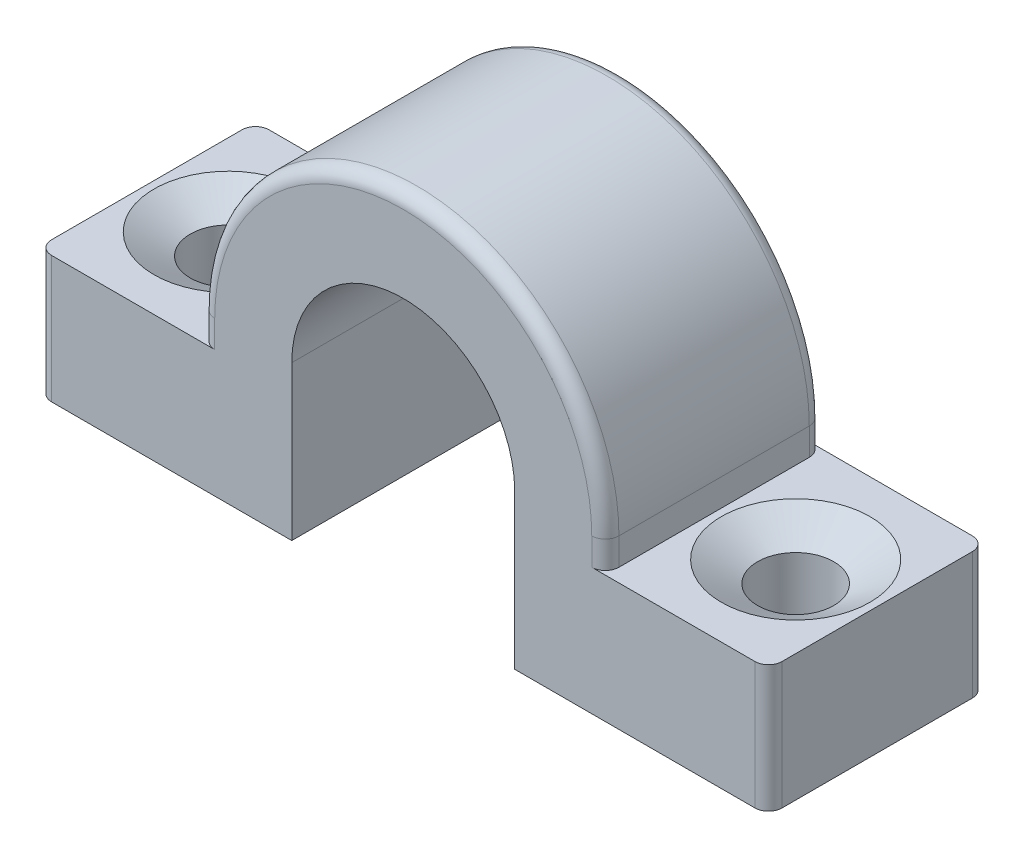
ISO-10303-21;
HEADER;
FILE_DESCRIPTION(('STEP AP214'),'2;1');
FILE_NAME('part.step','',(''),(''),'','','');
FILE_SCHEMA(('AUTOMOTIVE_DESIGN { 1 0 10303 214 1 1 1 1 }'));
ENDSEC;
DATA;
#1=APPLICATION_CONTEXT('core data for automotive mechanical design processes');
#2=APPLICATION_PROTOCOL_DEFINITION('international standard','automotive_design',2000,#1);
#3=PRODUCT_CONTEXT('',#1,'mechanical');
#4=PRODUCT('Part','Part','',(#3));
#5=PRODUCT_RELATED_PRODUCT_CATEGORY('part','',(#4));
#6=PRODUCT_DEFINITION_FORMATION('','',#4);
#7=PRODUCT_DEFINITION_CONTEXT('part definition',#1,'design');
#8=PRODUCT_DEFINITION('design','',#6,#7);
#9=PRODUCT_DEFINITION_SHAPE('','',#8);
#10=(LENGTH_UNIT() NAMED_UNIT(*) SI_UNIT(.MILLI.,.METRE.));
#11=(NAMED_UNIT(*) PLANE_ANGLE_UNIT() SI_UNIT($,.RADIAN.));
#12=(NAMED_UNIT(*) SI_UNIT($,.STERADIAN.) SOLID_ANGLE_UNIT());
#13=UNCERTAINTY_MEASURE_WITH_UNIT(LENGTH_MEASURE(1.E-05),#10,'distance_accuracy_value','');
#14=(GEOMETRIC_REPRESENTATION_CONTEXT(3) GLOBAL_UNCERTAINTY_ASSIGNED_CONTEXT((#13)) GLOBAL_UNIT_ASSIGNED_CONTEXT((#10,
#11,#12)) REPRESENTATION_CONTEXT('',''));
#15=CARTESIAN_POINT('',(0.,0.,0.));
#16=DIRECTION('',(0.,0.,1.));
#17=DIRECTION('',(1.,0.,0.));
#18=AXIS2_PLACEMENT_3D('',#15,#16,#17);
#19=CARTESIAN_POINT('',(0.,0.,12.));
#20=DIRECTION('',(0.,0.,-1.));
#21=DIRECTION('',(-1.,0.,0.));
#22=AXIS2_PLACEMENT_3D('',#19,#20,#21);
#23=CYLINDRICAL_SURFACE('',#22,11.15);
#24=DIRECTION('',(0.,0.,-1.));
#25=VECTOR('',#24,1.);
#26=CARTESIAN_POINT('',(11.15,0.,12.));
#27=LINE('',#26,#25);
#28=CARTESIAN_POINT('',(11.15,0.,11.25));
#29=VERTEX_POINT('',#28);
#30=CARTESIAN_POINT('',(11.15,0.,0.750000000000001));
#31=VERTEX_POINT('',#30);
#32=EDGE_CURVE('E213',#29,#31,#27,.T.);
#33=ORIENTED_EDGE('',*,*,#32,.T.);
#34=CARTESIAN_POINT('',(0.,0.,0.750000000000001));
#35=DIRECTION('',(0.,0.,1.));
#36=DIRECTION('',(1.,0.,0.));
#37=AXIS2_PLACEMENT_3D('',#34,#35,#36);
#38=CIRCLE('',#37,11.15);
#39=CARTESIAN_POINT('',(-11.15,0.,0.750000000000001));
#40=VERTEX_POINT('',#39);
#41=EDGE_CURVE('E302',#31,#40,#38,.T.);
#42=ORIENTED_EDGE('',*,*,#41,.T.);
#43=DIRECTION('',(0.,0.,-1.));
#44=VECTOR('',#43,1.);
#45=CARTESIAN_POINT('',(-11.15,0.,12.));
#46=LINE('',#45,#44);
#47=CARTESIAN_POINT('',(-11.15,0.,11.25));
#48=VERTEX_POINT('',#47);
#49=EDGE_CURVE('E253',#48,#40,#46,.T.);
#50=ORIENTED_EDGE('',*,*,#49,.F.);
#51=CARTESIAN_POINT('',(0.,0.,11.25));
#52=DIRECTION('',(0.,0.,1.));
#53=DIRECTION('',(1.,0.,0.));
#54=AXIS2_PLACEMENT_3D('',#51,#52,#53);
#55=CIRCLE('',#54,11.15);
#56=EDGE_CURVE('E300',#48,#29,#55,.F.);
#57=ORIENTED_EDGE('',*,*,#56,.T.);
#58=EDGE_LOOP('',(#33,#42,#50,#57));
#59=FACE_BOUND('',#58,.T.);
#60=ADVANCED_FACE('F35',(#59),#23,.T.);
#61=CARTESIAN_POINT('',(-11.15,0.,12.));
#62=DIRECTION('',(1.,0.,0.));
#63=DIRECTION('',(0.,0.,-1.));
#64=AXIS2_PLACEMENT_3D('',#61,#62,#63);
#65=PLANE('',#64);
#66=ORIENTED_EDGE('',*,*,#49,.T.);
#67=DIRECTION('',(0.,-1.,0.));
#68=VECTOR('',#67,1.);
#69=CARTESIAN_POINT('',(-11.15,0.,0.750000000000001));
#70=LINE('',#69,#68);
#71=CARTESIAN_POINT('',(-11.15,-1.5,0.750000000000001));
#72=VERTEX_POINT('',#71);
#73=EDGE_CURVE('E286',#40,#72,#70,.T.);
#74=ORIENTED_EDGE('',*,*,#73,.T.);
#75=DIRECTION('',(0.,0.,-1.));
#76=VECTOR('',#75,1.);
#77=CARTESIAN_POINT('',(-11.15,-1.5,12.));
#78=LINE('',#77,#76);
#79=CARTESIAN_POINT('',(-11.15,-1.5,11.25));
#80=VERTEX_POINT('',#79);
#81=EDGE_CURVE('E250',#80,#72,#78,.T.);
#82=ORIENTED_EDGE('',*,*,#81,.F.);
#83=DIRECTION('',(0.,-1.,0.));
#84=VECTOR('',#83,1.);
#85=CARTESIAN_POINT('',(-11.15,0.,11.25));
#86=LINE('',#85,#84);
#87=EDGE_CURVE('E284',#80,#48,#86,.F.);
#88=ORIENTED_EDGE('',*,*,#87,.T.);
#89=EDGE_LOOP('',(#66,#74,#82,#88));
#90=FACE_BOUND('',#89,.T.);
#91=ADVANCED_FACE('F380',(#90),#65,.F.);
#92=CARTESIAN_POINT('',(-11.15,-1.5,12.));
#93=DIRECTION('',(0.,-1.,0.));
#94=DIRECTION('',(1.,0.,0.));
#95=AXIS2_PLACEMENT_3D('',#92,#93,#94);
#96=PLANE('',#95);
#97=CARTESIAN_POINT('',(-15.65,-1.5,6.));
#98=DIRECTION('',(0.,-1.,0.));
#99=DIRECTION('',(1.,0.,0.));
#100=AXIS2_PLACEMENT_3D('',#97,#98,#99);
#101=CIRCLE('',#100,4.10000000000001);
#102=CARTESIAN_POINT('',(-11.55,-1.5,6.));
#103=VERTEX_POINT('',#102);
#104=EDGE_CURVE('E265',#103,#103,#101,.T.);
#105=ORIENTED_EDGE('',*,*,#104,.T.);
#106=EDGE_LOOP('',(#105));
#107=FACE_BOUND('',#106,.T.);
#108=DIRECTION('',(-1.,0.,0.));
#109=VECTOR('',#108,1.);
#110=CARTESIAN_POINT('',(-11.15,-1.5,0.));
#111=LINE('',#110,#109);
#112=CARTESIAN_POINT('',(-10.4,-1.5,0.));
#113=VERTEX_POINT('',#112);
#114=CARTESIAN_POINT('',(-19.4,-1.5,0.));
#115=VERTEX_POINT('',#114);
#116=EDGE_CURVE('E214',#113,#115,#111,.T.);
#117=ORIENTED_EDGE('',*,*,#116,.T.);
#118=CARTESIAN_POINT('',(-19.4,-1.5,0.750000000000001));
#119=DIRECTION('',(0.,-1.,0.));
#120=DIRECTION('',(1.,0.,0.));
#121=AXIS2_PLACEMENT_3D('',#118,#119,#120);
#122=CIRCLE('',#121,0.75);
#123=CARTESIAN_POINT('',(-20.15,-1.5,0.750000000000001));
#124=VERTEX_POINT('',#123);
#125=EDGE_CURVE('E52',#115,#124,#122,.F.);
#126=ORIENTED_EDGE('',*,*,#125,.T.);
#127=DIRECTION('',(0.,0.,-1.));
#128=VECTOR('',#127,1.);
#129=CARTESIAN_POINT('',(-20.15,-1.5,12.));
#130=LINE('',#129,#128);
#131=CARTESIAN_POINT('',(-20.15,-1.5,11.25));
#132=VERTEX_POINT('',#131);
#133=EDGE_CURVE('E248',#132,#124,#130,.T.);
#134=ORIENTED_EDGE('',*,*,#133,.F.);
#135=CARTESIAN_POINT('',(-19.4,-1.5,11.25));
#136=DIRECTION('',(0.,-1.,0.));
#137=DIRECTION('',(1.,0.,0.));
#138=AXIS2_PLACEMENT_3D('',#135,#136,#137);
#139=CIRCLE('',#138,0.75);
#140=CARTESIAN_POINT('',(-19.4,-1.5,12.));
#141=VERTEX_POINT('',#140);
#142=EDGE_CURVE('E325',#132,#141,#139,.F.);
#143=ORIENTED_EDGE('',*,*,#142,.T.);
#144=DIRECTION('',(-1.,0.,0.));
#145=VECTOR('',#144,1.);
#146=CARTESIAN_POINT('',(-11.15,-1.5,12.));
#147=LINE('',#146,#145);
#148=CARTESIAN_POINT('',(-10.4,-1.5,12.));
#149=VERTEX_POINT('',#148);
#150=EDGE_CURVE('E185',#149,#141,#147,.T.);
#151=ORIENTED_EDGE('',*,*,#150,.F.);
#152=CARTESIAN_POINT('',(-10.4,-1.5,11.25));
#153=DIRECTION('',(0.,-1.,0.));
#154=DIRECTION('',(1.,0.,0.));
#155=AXIS2_PLACEMENT_3D('',#152,#153,#154);
#156=CIRCLE('',#155,0.75);
#157=EDGE_CURVE('E11',#149,#80,#156,.T.);
#158=ORIENTED_EDGE('',*,*,#157,.T.);
#159=ORIENTED_EDGE('',*,*,#81,.T.);
#160=CARTESIAN_POINT('',(-10.4,-1.5,0.750000000000001));
#161=DIRECTION('',(0.,-1.,0.));
#162=DIRECTION('',(1.,0.,0.));
#163=AXIS2_PLACEMENT_3D('',#160,#161,#162);
#164=CIRCLE('',#163,0.75);
#165=EDGE_CURVE('E330',#72,#113,#164,.T.);
#166=ORIENTED_EDGE('',*,*,#165,.T.);
#167=EDGE_LOOP('',(#117,#126,#134,#143,#151,#158,#159,#166));
#168=FACE_BOUND('',#167,.T.);
#169=ADVANCED_FACE('F386',(#107,#168),#96,.F.);
#170=CARTESIAN_POINT('',(-20.15,-1.5,12.));
#171=DIRECTION('',(1.,0.,0.));
#172=DIRECTION('',(0.,0.,-1.));
#173=AXIS2_PLACEMENT_3D('',#170,#171,#172);
#174=PLANE('',#173);
#175=ORIENTED_EDGE('',*,*,#133,.T.);
#176=DIRECTION('',(0.,-1.,0.));
#177=VECTOR('',#176,1.);
#178=CARTESIAN_POINT('',(-20.15,-1.5,0.750000000000001));
#179=LINE('',#178,#177);
#180=CARTESIAN_POINT('',(-20.15,-8.5,0.750000000000001));
#181=VERTEX_POINT('',#180);
#182=EDGE_CURVE('E318',#124,#181,#179,.T.);
#183=ORIENTED_EDGE('',*,*,#182,.T.);
#184=DIRECTION('',(0.,0.,-1.));
#185=VECTOR('',#184,1.);
#186=CARTESIAN_POINT('',(-20.15,-8.5,12.));
#187=LINE('',#186,#185);
#188=CARTESIAN_POINT('',(-20.15,-8.5,11.25));
#189=VERTEX_POINT('',#188);
#190=EDGE_CURVE('E195',#189,#181,#187,.T.);
#191=ORIENTED_EDGE('',*,*,#190,.F.);
#192=DIRECTION('',(0.,-1.,0.));
#193=VECTOR('',#192,1.);
#194=CARTESIAN_POINT('',(-20.15,-1.5,11.25));
#195=LINE('',#194,#193);
#196=EDGE_CURVE('E59',#189,#132,#195,.F.);
#197=ORIENTED_EDGE('',*,*,#196,.T.);
#198=EDGE_LOOP('',(#175,#183,#191,#197));
#199=FACE_BOUND('',#198,.T.);
#200=ADVANCED_FACE('F457',(#199),#174,.F.);
#201=CARTESIAN_POINT('',(-20.15,-8.5,12.));
#202=DIRECTION('',(0.,1.,0.));
#203=DIRECTION('',(-1.,0.,0.));
#204=AXIS2_PLACEMENT_3D('',#201,#202,#203);
#205=PLANE('',#204);
#206=CARTESIAN_POINT('',(-15.65,-8.5,6.));
#207=DIRECTION('',(0.,1.,0.));
#208=DIRECTION('',(-1.,0.,0.));
#209=AXIS2_PLACEMENT_3D('',#206,#207,#208);
#210=CIRCLE('',#209,2.1);
#211=CARTESIAN_POINT('',(-17.75,-8.5,6.));
#212=VERTEX_POINT('',#211);
#213=EDGE_CURVE('E216',#212,#212,#210,.T.);
#214=ORIENTED_EDGE('',*,*,#213,.T.);
#215=EDGE_LOOP('',(#214));
#216=FACE_BOUND('',#215,.T.);
#217=ORIENTED_EDGE('',*,*,#190,.T.);
#218=CARTESIAN_POINT('',(-19.4,-8.5,0.750000000000001));
#219=DIRECTION('',(0.,1.,0.));
#220=DIRECTION('',(-1.,0.,0.));
#221=AXIS2_PLACEMENT_3D('',#218,#219,#220);
#222=CIRCLE('',#221,0.75);
#223=CARTESIAN_POINT('',(-19.4,-8.5,0.));
#224=VERTEX_POINT('',#223);
#225=EDGE_CURVE('E323',#181,#224,#222,.F.);
#226=ORIENTED_EDGE('',*,*,#225,.T.);
#227=DIRECTION('',(1.,0.,0.));
#228=VECTOR('',#227,1.);
#229=CARTESIAN_POINT('',(-20.15,-8.5,0.));
#230=LINE('',#229,#228);
#231=CARTESIAN_POINT('',(-6.15,-8.5,0.));
#232=VERTEX_POINT('',#231);
#233=EDGE_CURVE('E192',#224,#232,#230,.T.);
#234=ORIENTED_EDGE('',*,*,#233,.T.);
#235=DIRECTION('',(0.,0.,-1.));
#236=VECTOR('',#235,1.);
#237=CARTESIAN_POINT('',(-6.15,-8.5,12.));
#238=LINE('',#237,#236);
#239=CARTESIAN_POINT('',(-6.15,-8.5,12.));
#240=VERTEX_POINT('',#239);
#241=EDGE_CURVE('E188',#240,#232,#238,.T.);
#242=ORIENTED_EDGE('',*,*,#241,.F.);
#243=DIRECTION('',(1.,0.,0.));
#244=VECTOR('',#243,1.);
#245=CARTESIAN_POINT('',(-20.15,-8.5,12.));
#246=LINE('',#245,#244);
#247=CARTESIAN_POINT('',(-19.4,-8.5,12.));
#248=VERTEX_POINT('',#247);
#249=EDGE_CURVE('E175',#248,#240,#246,.T.);
#250=ORIENTED_EDGE('',*,*,#249,.F.);
#251=CARTESIAN_POINT('',(-19.4,-8.5,11.25));
#252=DIRECTION('',(0.,1.,0.));
#253=DIRECTION('',(-1.,0.,0.));
#254=AXIS2_PLACEMENT_3D('',#251,#252,#253);
#255=CIRCLE('',#254,0.75);
#256=EDGE_CURVE('E321',#248,#189,#255,.F.);
#257=ORIENTED_EDGE('',*,*,#256,.T.);
#258=EDGE_LOOP('',(#217,#226,#234,#242,#250,#257));
#259=FACE_BOUND('',#258,.T.);
#260=ADVANCED_FACE('F190',(#216,#259),#205,.F.);
#261=CARTESIAN_POINT('',(-6.15,-8.5,12.));
#262=DIRECTION('',(-1.,0.,0.));
#263=DIRECTION('',(0.,-1.,0.));
#264=AXIS2_PLACEMENT_3D('',#261,#262,#263);
#265=PLANE('',#264);
#266=DIRECTION('',(0.,1.,0.));
#267=VECTOR('',#266,1.);
#268=CARTESIAN_POINT('',(-6.15,-8.5,0.));
#269=LINE('',#268,#267);
#270=CARTESIAN_POINT('',(-6.15,0.,0.));
#271=VERTEX_POINT('',#270);
#272=EDGE_CURVE('E218',#232,#271,#269,.T.);
#273=ORIENTED_EDGE('',*,*,#272,.T.);
#274=DIRECTION('',(0.,0.,-1.));
#275=VECTOR('',#274,1.);
#276=CARTESIAN_POINT('',(-6.15,0.,12.));
#277=LINE('',#276,#275);
#278=CARTESIAN_POINT('',(-6.15,0.,12.));
#279=VERTEX_POINT('',#278);
#280=EDGE_CURVE('E196',#279,#271,#277,.T.);
#281=ORIENTED_EDGE('',*,*,#280,.F.);
#282=DIRECTION('',(0.,1.,0.));
#283=VECTOR('',#282,1.);
#284=CARTESIAN_POINT('',(-6.15,-8.5,12.));
#285=LINE('',#284,#283);
#286=EDGE_CURVE('E179',#240,#279,#285,.T.);
#287=ORIENTED_EDGE('',*,*,#286,.F.);
#288=ORIENTED_EDGE('',*,*,#241,.T.);
#289=EDGE_LOOP('',(#273,#281,#287,#288));
#290=FACE_BOUND('',#289,.T.);
#291=ADVANCED_FACE('F198',(#290),#265,.F.);
#292=CARTESIAN_POINT('',(0.,0.,12.));
#293=DIRECTION('',(0.,0.,-1.));
#294=DIRECTION('',(-1.,0.,0.));
#295=AXIS2_PLACEMENT_3D('',#292,#293,#294);
#296=CYLINDRICAL_SURFACE('',#295,6.15);
#297=CARTESIAN_POINT('',(0.,0.,0.));
#298=DIRECTION('',(0.,0.,-1.));
#299=DIRECTION('',(1.,0.,0.));
#300=AXIS2_PLACEMENT_3D('',#297,#298,#299);
#301=CIRCLE('',#300,6.15);
#302=CARTESIAN_POINT('',(6.15,0.,0.));
#303=VERTEX_POINT('',#302);
#304=EDGE_CURVE('E220',#271,#303,#301,.T.);
#305=ORIENTED_EDGE('',*,*,#304,.T.);
#306=DIRECTION('',(0.,0.,-1.));
#307=VECTOR('',#306,1.);
#308=CARTESIAN_POINT('',(6.15,0.,12.));
#309=LINE('',#308,#307);
#310=CARTESIAN_POINT('',(6.15,0.,12.));
#311=VERTEX_POINT('',#310);
#312=EDGE_CURVE('E243',#311,#303,#309,.T.);
#313=ORIENTED_EDGE('',*,*,#312,.F.);
#314=CARTESIAN_POINT('',(0.,0.,12.));
#315=DIRECTION('',(0.,0.,-1.));
#316=DIRECTION('',(1.,0.,0.));
#317=AXIS2_PLACEMENT_3D('',#314,#315,#316);
#318=CIRCLE('',#317,6.15);
#319=EDGE_CURVE('E201',#279,#311,#318,.T.);
#320=ORIENTED_EDGE('',*,*,#319,.F.);
#321=ORIENTED_EDGE('',*,*,#280,.T.);
#322=EDGE_LOOP('',(#305,#313,#320,#321));
#323=FACE_BOUND('',#322,.T.);
#324=ADVANCED_FACE('F462',(#323),#296,.F.);
#325=CARTESIAN_POINT('',(6.15,0.,12.));
#326=DIRECTION('',(1.,0.,0.));
#327=DIRECTION('',(0.,1.,0.));
#328=AXIS2_PLACEMENT_3D('',#325,#326,#327);
#329=PLANE('',#328);
#330=DIRECTION('',(0.,-1.,0.));
#331=VECTOR('',#330,1.);
#332=CARTESIAN_POINT('',(6.15,0.,0.));
#333=LINE('',#332,#331);
#334=CARTESIAN_POINT('',(6.15,-8.5,0.));
#335=VERTEX_POINT('',#334);
#336=EDGE_CURVE('E222',#303,#335,#333,.T.);
#337=ORIENTED_EDGE('',*,*,#336,.T.);
#338=DIRECTION('',(0.,0.,-1.));
#339=VECTOR('',#338,1.);
#340=CARTESIAN_POINT('',(6.15,-8.5,12.));
#341=LINE('',#340,#339);
#342=CARTESIAN_POINT('',(6.15,-8.5,12.));
#343=VERTEX_POINT('',#342);
#344=EDGE_CURVE('E240',#343,#335,#341,.T.);
#345=ORIENTED_EDGE('',*,*,#344,.F.);
#346=DIRECTION('',(0.,-1.,0.));
#347=VECTOR('',#346,1.);
#348=CARTESIAN_POINT('',(6.15,0.,12.));
#349=LINE('',#348,#347);
#350=EDGE_CURVE('E203',#311,#343,#349,.T.);
#351=ORIENTED_EDGE('',*,*,#350,.F.);
#352=ORIENTED_EDGE('',*,*,#312,.T.);
#353=EDGE_LOOP('',(#337,#345,#351,#352));
#354=FACE_BOUND('',#353,.T.);
#355=ADVANCED_FACE('F469',(#354),#329,.F.);
#356=CARTESIAN_POINT('',(6.15,-8.5,12.));
#357=DIRECTION('',(0.,1.,0.));
#358=DIRECTION('',(-1.,0.,0.));
#359=AXIS2_PLACEMENT_3D('',#356,#357,#358);
#360=PLANE('',#359);
#361=CARTESIAN_POINT('',(15.65,-8.5,6.));
#362=DIRECTION('',(0.,1.,0.));
#363=DIRECTION('',(-1.,0.,0.));
#364=AXIS2_PLACEMENT_3D('',#361,#362,#363);
#365=CIRCLE('',#364,2.1);
#366=CARTESIAN_POINT('',(13.55,-8.5,6.));
#367=VERTEX_POINT('',#366);
#368=EDGE_CURVE('E339',#367,#367,#365,.T.);
#369=ORIENTED_EDGE('',*,*,#368,.T.);
#370=EDGE_LOOP('',(#369));
#371=FACE_BOUND('',#370,.T.);
#372=DIRECTION('',(1.,0.,0.));
#373=VECTOR('',#372,1.);
#374=CARTESIAN_POINT('',(6.15,-8.5,0.));
#375=LINE('',#374,#373);
#376=CARTESIAN_POINT('',(19.4,-8.5,0.));
#377=VERTEX_POINT('',#376);
#378=EDGE_CURVE('E224',#335,#377,#375,.T.);
#379=ORIENTED_EDGE('',*,*,#378,.T.);
#380=CARTESIAN_POINT('',(19.4,-8.5,0.750000000000001));
#381=DIRECTION('',(0.,1.,0.));
#382=DIRECTION('',(-1.,0.,0.));
#383=AXIS2_PLACEMENT_3D('',#380,#381,#382);
#384=CIRCLE('',#383,0.75);
#385=CARTESIAN_POINT('',(20.15,-8.5,0.750000000000001));
#386=VERTEX_POINT('',#385);
#387=EDGE_CURVE('E315',#377,#386,#384,.F.);
#388=ORIENTED_EDGE('',*,*,#387,.T.);
#389=DIRECTION('',(0.,0.,-1.));
#390=VECTOR('',#389,1.);
#391=CARTESIAN_POINT('',(20.15,-8.5,12.));
#392=LINE('',#391,#390);
#393=CARTESIAN_POINT('',(20.15,-8.5,11.25));
#394=VERTEX_POINT('',#393);
#395=EDGE_CURVE('E237',#394,#386,#392,.T.);
#396=ORIENTED_EDGE('',*,*,#395,.F.);
#397=CARTESIAN_POINT('',(19.4,-8.5,11.25));
#398=DIRECTION('',(0.,1.,0.));
#399=DIRECTION('',(-1.,0.,0.));
#400=AXIS2_PLACEMENT_3D('',#397,#398,#399);
#401=CIRCLE('',#400,0.75);
#402=CARTESIAN_POINT('',(19.4,-8.5,12.));
#403=VERTEX_POINT('',#402);
#404=EDGE_CURVE('E313',#394,#403,#401,.F.);
#405=ORIENTED_EDGE('',*,*,#404,.T.);
#406=DIRECTION('',(1.,0.,0.));
#407=VECTOR('',#406,1.);
#408=CARTESIAN_POINT('',(6.15,-8.5,12.));
#409=LINE('',#408,#407);
#410=EDGE_CURVE('E208',#343,#403,#409,.T.);
#411=ORIENTED_EDGE('',*,*,#410,.F.);
#412=ORIENTED_EDGE('',*,*,#344,.T.);
#413=EDGE_LOOP('',(#379,#388,#396,#405,#411,#412));
#414=FACE_BOUND('',#413,.T.);
#415=ADVANCED_FACE('F472',(#371,#414),#360,.F.);
#416=CARTESIAN_POINT('',(20.15,-8.5,12.));
#417=DIRECTION('',(-1.,0.,0.));
#418=DIRECTION('',(0.,0.,1.));
#419=AXIS2_PLACEMENT_3D('',#416,#417,#418);
#420=PLANE('',#419);
#421=ORIENTED_EDGE('',*,*,#395,.T.);
#422=DIRECTION('',(0.,1.,0.));
#423=VECTOR('',#422,1.);
#424=CARTESIAN_POINT('',(20.15,-8.5,0.750000000000001));
#425=LINE('',#424,#423);
#426=CARTESIAN_POINT('',(20.15,-1.5,0.750000000000001));
#427=VERTEX_POINT('',#426);
#428=EDGE_CURVE('E306',#386,#427,#425,.T.);
#429=ORIENTED_EDGE('',*,*,#428,.T.);
#430=DIRECTION('',(0.,0.,-1.));
#431=VECTOR('',#430,1.);
#432=CARTESIAN_POINT('',(20.15,-1.5,12.));
#433=LINE('',#432,#431);
#434=CARTESIAN_POINT('',(20.15,-1.5,11.25));
#435=VERTEX_POINT('',#434);
#436=EDGE_CURVE('E234',#435,#427,#433,.T.);
#437=ORIENTED_EDGE('',*,*,#436,.F.);
#438=DIRECTION('',(0.,1.,0.));
#439=VECTOR('',#438,1.);
#440=CARTESIAN_POINT('',(20.15,-8.5,11.25));
#441=LINE('',#440,#439);
#442=EDGE_CURVE('E304',#435,#394,#441,.F.);
#443=ORIENTED_EDGE('',*,*,#442,.T.);
#444=EDGE_LOOP('',(#421,#429,#437,#443));
#445=FACE_BOUND('',#444,.T.);
#446=ADVANCED_FACE('F478',(#445),#420,.F.);
#447=CARTESIAN_POINT('',(20.15,-1.5,12.));
#448=DIRECTION('',(0.,-1.,0.));
#449=DIRECTION('',(1.,0.,0.));
#450=AXIS2_PLACEMENT_3D('',#447,#448,#449);
#451=PLANE('',#450);
#452=CARTESIAN_POINT('',(15.65,-1.5,6.));
#453=DIRECTION('',(0.,-1.,0.));
#454=DIRECTION('',(1.,0.,0.));
#455=AXIS2_PLACEMENT_3D('',#452,#453,#454);
#456=CIRCLE('',#455,4.10000000000001);
#457=CARTESIAN_POINT('',(19.75,-1.5,6.));
#458=VERTEX_POINT('',#457);
#459=EDGE_CURVE('E259',#458,#458,#456,.T.);
#460=ORIENTED_EDGE('',*,*,#459,.T.);
#461=EDGE_LOOP('',(#460));
#462=FACE_BOUND('',#461,.T.);
#463=ORIENTED_EDGE('',*,*,#436,.T.);
#464=CARTESIAN_POINT('',(19.4,-1.5,0.750000000000001));
#465=DIRECTION('',(0.,-1.,0.));
#466=DIRECTION('',(1.,0.,0.));
#467=AXIS2_PLACEMENT_3D('',#464,#465,#466);
#468=CIRCLE('',#467,0.75);
#469=CARTESIAN_POINT('',(19.4,-1.5,0.));
#470=VERTEX_POINT('',#469);
#471=EDGE_CURVE('E311',#427,#470,#468,.F.);
#472=ORIENTED_EDGE('',*,*,#471,.T.);
#473=DIRECTION('',(-1.,0.,0.));
#474=VECTOR('',#473,1.);
#475=CARTESIAN_POINT('',(20.15,-1.5,0.));
#476=LINE('',#475,#474);
#477=CARTESIAN_POINT('',(10.4,-1.5,0.));
#478=VERTEX_POINT('',#477);
#479=EDGE_CURVE('E227',#470,#478,#476,.T.);
#480=ORIENTED_EDGE('',*,*,#479,.T.);
#481=CARTESIAN_POINT('',(10.4,-1.5,0.750000000000001));
#482=DIRECTION('',(0.,-1.,0.));
#483=DIRECTION('',(1.,0.,0.));
#484=AXIS2_PLACEMENT_3D('',#481,#482,#483);
#485=CIRCLE('',#484,0.75);
#486=CARTESIAN_POINT('',(11.15,-1.5,0.750000000000001));
#487=VERTEX_POINT('',#486);
#488=EDGE_CURVE('E328',#478,#487,#485,.T.);
#489=ORIENTED_EDGE('',*,*,#488,.T.);
#490=DIRECTION('',(0.,0.,-1.));
#491=VECTOR('',#490,1.);
#492=CARTESIAN_POINT('',(11.15,-1.5,12.));
#493=LINE('',#492,#491);
#494=CARTESIAN_POINT('',(11.15,-1.5,11.25));
#495=VERTEX_POINT('',#494);
#496=EDGE_CURVE('E231',#495,#487,#493,.T.);
#497=ORIENTED_EDGE('',*,*,#496,.F.);
#498=CARTESIAN_POINT('',(10.4,-1.5,11.25));
#499=DIRECTION('',(0.,-1.,0.));
#500=DIRECTION('',(1.,0.,0.));
#501=AXIS2_PLACEMENT_3D('',#498,#499,#500);
#502=CIRCLE('',#501,0.75);
#503=CARTESIAN_POINT('',(10.4,-1.5,12.));
#504=VERTEX_POINT('',#503);
#505=EDGE_CURVE('E44',#495,#504,#502,.T.);
#506=ORIENTED_EDGE('',*,*,#505,.T.);
#507=DIRECTION('',(-1.,0.,0.));
#508=VECTOR('',#507,1.);
#509=CARTESIAN_POINT('',(20.15,-1.5,12.));
#510=LINE('',#509,#508);
#511=CARTESIAN_POINT('',(19.4,-1.5,12.));
#512=VERTEX_POINT('',#511);
#513=EDGE_CURVE('E211',#512,#504,#510,.T.);
#514=ORIENTED_EDGE('',*,*,#513,.F.);
#515=CARTESIAN_POINT('',(19.4,-1.5,11.25));
#516=DIRECTION('',(0.,-1.,0.));
#517=DIRECTION('',(1.,0.,0.));
#518=AXIS2_PLACEMENT_3D('',#515,#516,#517);
#519=CIRCLE('',#518,0.75);
#520=EDGE_CURVE('E309',#512,#435,#519,.F.);
#521=ORIENTED_EDGE('',*,*,#520,.T.);
#522=EDGE_LOOP('',(#463,#472,#480,#489,#497,#506,#514,#521));
#523=FACE_BOUND('',#522,.T.);
#524=ADVANCED_FACE('F361',(#462,#523),#451,.F.);
#525=CARTESIAN_POINT('',(11.15,-1.5,12.));
#526=DIRECTION('',(-1.,0.,0.));
#527=DIRECTION('',(0.,0.,1.));
#528=AXIS2_PLACEMENT_3D('',#525,#526,#527);
#529=PLANE('',#528);
#530=ORIENTED_EDGE('',*,*,#496,.T.);
#531=DIRECTION('',(0.,1.,0.));
#532=VECTOR('',#531,1.);
#533=CARTESIAN_POINT('',(11.15,-1.5,0.750000000000001));
#534=LINE('',#533,#532);
#535=EDGE_CURVE('E270',#487,#31,#534,.T.);
#536=ORIENTED_EDGE('',*,*,#535,.T.);
#537=ORIENTED_EDGE('',*,*,#32,.F.);
#538=DIRECTION('',(0.,1.,0.));
#539=VECTOR('',#538,1.);
#540=CARTESIAN_POINT('',(11.15,-1.5,11.25));
#541=LINE('',#540,#539);
#542=EDGE_CURVE('E268',#29,#495,#541,.F.);
#543=ORIENTED_EDGE('',*,*,#542,.T.);
#544=EDGE_LOOP('',(#530,#536,#537,#543));
#545=FACE_BOUND('',#544,.T.);
#546=ADVANCED_FACE('F365',(#545),#529,.F.);
#547=CARTESIAN_POINT('',(0.,0.,12.));
#548=DIRECTION('',(0.,0.,1.));
#549=DIRECTION('',(1.,0.,0.));
#550=AXIS2_PLACEMENT_3D('',#547,#548,#549);
#551=PLANE('',#550);
#552=ORIENTED_EDGE('',*,*,#513,.T.);
#553=DIRECTION('',(0.,1.,0.));
#554=VECTOR('',#553,1.);
#555=CARTESIAN_POINT('',(10.4,0.,12.));
#556=LINE('',#555,#554);
#557=CARTESIAN_POINT('',(10.4,0.,12.));
#558=VERTEX_POINT('',#557);
#559=EDGE_CURVE('E297',#504,#558,#556,.T.);
#560=ORIENTED_EDGE('',*,*,#559,.T.);
#561=CARTESIAN_POINT('',(0.,0.,12.));
#562=DIRECTION('',(0.,0.,1.));
#563=DIRECTION('',(1.,0.,0.));
#564=AXIS2_PLACEMENT_3D('',#561,#562,#563);
#565=CIRCLE('',#564,10.4);
#566=CARTESIAN_POINT('',(-10.4,0.,12.));
#567=VERTEX_POINT('',#566);
#568=EDGE_CURVE('E292',#558,#567,#565,.T.);
#569=ORIENTED_EDGE('',*,*,#568,.T.);
#570=DIRECTION('',(0.,-1.,0.));
#571=VECTOR('',#570,1.);
#572=CARTESIAN_POINT('',(-10.4,-1.5,12.));
#573=LINE('',#572,#571);
#574=EDGE_CURVE('E294',#567,#149,#573,.T.);
#575=ORIENTED_EDGE('',*,*,#574,.T.);
#576=ORIENTED_EDGE('',*,*,#150,.T.);
#577=DIRECTION('',(0.,-1.,0.));
#578=VECTOR('',#577,1.);
#579=CARTESIAN_POINT('',(-19.4,-8.5,12.));
#580=LINE('',#579,#578);
#581=EDGE_CURVE('E183',#141,#248,#580,.T.);
#582=ORIENTED_EDGE('',*,*,#581,.T.);
#583=ORIENTED_EDGE('',*,*,#249,.T.);
#584=ORIENTED_EDGE('',*,*,#286,.T.);
#585=ORIENTED_EDGE('',*,*,#319,.T.);
#586=ORIENTED_EDGE('',*,*,#350,.T.);
#587=ORIENTED_EDGE('',*,*,#410,.T.);
#588=DIRECTION('',(0.,1.,0.));
#589=VECTOR('',#588,1.);
#590=CARTESIAN_POINT('',(19.4,-1.5,12.));
#591=LINE('',#590,#589);
#592=EDGE_CURVE('E289',#403,#512,#591,.T.);
#593=ORIENTED_EDGE('',*,*,#592,.T.);
#594=EDGE_LOOP('',(#552,#560,#569,#575,#576,#582,#583,#584,#585,#586,#587,#593));
#595=FACE_BOUND('',#594,.T.);
#596=ADVANCED_FACE('F177',(#595),#551,.T.);
#597=CARTESIAN_POINT('',(0.,0.,0.));
#598=DIRECTION('',(0.,0.,1.));
#599=DIRECTION('',(1.,0.,0.));
#600=AXIS2_PLACEMENT_3D('',#597,#598,#599);
#601=PLANE('',#600);
#602=DIRECTION('',(0.,1.,0.));
#603=VECTOR('',#602,1.);
#604=CARTESIAN_POINT('',(10.4,0.,0.));
#605=LINE('',#604,#603);
#606=CARTESIAN_POINT('',(10.4,0.,0.));
#607=VERTEX_POINT('',#606);
#608=EDGE_CURVE('E281',#607,#478,#605,.F.);
#609=ORIENTED_EDGE('',*,*,#608,.T.);
#610=ORIENTED_EDGE('',*,*,#479,.F.);
#611=DIRECTION('',(0.,1.,0.));
#612=VECTOR('',#611,1.);
#613=CARTESIAN_POINT('',(19.4,0.,0.));
#614=LINE('',#613,#612);
#615=EDGE_CURVE('E275',#470,#377,#614,.F.);
#616=ORIENTED_EDGE('',*,*,#615,.T.);
#617=ORIENTED_EDGE('',*,*,#378,.F.);
#618=ORIENTED_EDGE('',*,*,#336,.F.);
#619=ORIENTED_EDGE('',*,*,#304,.F.);
#620=ORIENTED_EDGE('',*,*,#272,.F.);
#621=ORIENTED_EDGE('',*,*,#233,.F.);
#622=DIRECTION('',(0.,-1.,0.));
#623=VECTOR('',#622,1.);
#624=CARTESIAN_POINT('',(-19.4,0.,0.));
#625=LINE('',#624,#623);
#626=EDGE_CURVE('E273',#224,#115,#625,.F.);
#627=ORIENTED_EDGE('',*,*,#626,.T.);
#628=ORIENTED_EDGE('',*,*,#116,.F.);
#629=DIRECTION('',(0.,-1.,0.));
#630=VECTOR('',#629,1.);
#631=CARTESIAN_POINT('',(-10.4,0.,0.));
#632=LINE('',#631,#630);
#633=CARTESIAN_POINT('',(-10.4,0.,0.));
#634=VERTEX_POINT('',#633);
#635=EDGE_CURVE('E279',#113,#634,#632,.F.);
#636=ORIENTED_EDGE('',*,*,#635,.T.);
#637=CARTESIAN_POINT('',(0.,0.,0.));
#638=DIRECTION('',(0.,0.,1.));
#639=DIRECTION('',(1.,0.,0.));
#640=AXIS2_PLACEMENT_3D('',#637,#638,#639);
#641=CIRCLE('',#640,10.4);
#642=EDGE_CURVE('E277',#634,#607,#641,.F.);
#643=ORIENTED_EDGE('',*,*,#642,.T.);
#644=EDGE_LOOP('',(#609,#610,#616,#617,#618,#619,#620,#621,#627,#628,#636,#643));
#645=FACE_BOUND('',#644,.T.);
#646=ADVANCED_FACE('F408',(#645),#601,.F.);
#647=CARTESIAN_POINT('',(15.65,-8.5,6.));
#648=DIRECTION('',(0.,1.,0.));
#649=DIRECTION('',(-1.,0.,0.));
#650=AXIS2_PLACEMENT_3D('',#647,#648,#649);
#651=CYLINDRICAL_SURFACE('',#650,2.1);
#652=CARTESIAN_POINT('',(15.65,-2.65470053837925,6.));
#653=DIRECTION('',(0.,-1.,0.));
#654=DIRECTION('',(0.,0.,-1.));
#655=AXIS2_PLACEMENT_3D('',#652,#653,#654);
#656=CIRCLE('',#655,2.1);
#657=CARTESIAN_POINT('',(15.65,-2.65470053837925,3.9));
#658=VERTEX_POINT('',#657);
#659=EDGE_CURVE('E256',#658,#658,#656,.F.);
#660=ORIENTED_EDGE('',*,*,#659,.T.);
#661=EDGE_LOOP('',(#660));
#662=FACE_BOUND('',#661,.T.);
#663=ORIENTED_EDGE('',*,*,#368,.F.);
#664=EDGE_LOOP('',(#663));
#665=FACE_BOUND('',#664,.T.);
#666=ADVANCED_FACE('F398',(#662,#665),#651,.F.);
#667=CARTESIAN_POINT('',(-15.65,-8.5,6.));
#668=DIRECTION('',(0.,1.,0.));
#669=DIRECTION('',(-1.,0.,0.));
#670=AXIS2_PLACEMENT_3D('',#667,#668,#669);
#671=CYLINDRICAL_SURFACE('',#670,2.1);
#672=CARTESIAN_POINT('',(-15.65,-2.65470053837925,6.));
#673=DIRECTION('',(0.,-1.,0.));
#674=DIRECTION('',(0.,0.,-1.));
#675=AXIS2_PLACEMENT_3D('',#672,#673,#674);
#676=CIRCLE('',#675,2.1);
#677=CARTESIAN_POINT('',(-15.65,-2.65470053837925,3.9));
#678=VERTEX_POINT('',#677);
#679=EDGE_CURVE('E262',#678,#678,#676,.F.);
#680=ORIENTED_EDGE('',*,*,#679,.T.);
#681=EDGE_LOOP('',(#680));
#682=FACE_BOUND('',#681,.T.);
#683=ORIENTED_EDGE('',*,*,#213,.F.);
#684=EDGE_LOOP('',(#683));
#685=FACE_BOUND('',#684,.T.);
#686=ADVANCED_FACE('F395',(#682,#685),#671,.F.);
#687=CARTESIAN_POINT('',(15.65,-2.65470053837925,6.));
#688=DIRECTION('',(0.,1.,0.));
#689=DIRECTION('',(0.,0.,1.));
#690=AXIS2_PLACEMENT_3D('',#687,#688,#689);
#691=CONICAL_SURFACE('',#690,2.1,1.0471975511966);
#692=ORIENTED_EDGE('',*,*,#459,.F.);
#693=EDGE_LOOP('',(#692));
#694=FACE_BOUND('',#693,.T.);
#695=ORIENTED_EDGE('',*,*,#659,.F.);
#696=EDGE_LOOP('',(#695));
#697=FACE_BOUND('',#696,.T.);
#698=ADVANCED_FACE('F397',(#694,#697),#691,.F.);
#699=CARTESIAN_POINT('',(-15.65,-2.65470053837925,6.));
#700=DIRECTION('',(0.,1.,0.));
#701=DIRECTION('',(0.,0.,1.));
#702=AXIS2_PLACEMENT_3D('',#699,#700,#701);
#703=CONICAL_SURFACE('',#702,2.1,1.0471975511966);
#704=ORIENTED_EDGE('',*,*,#104,.F.);
#705=EDGE_LOOP('',(#704));
#706=FACE_BOUND('',#705,.T.);
#707=ORIENTED_EDGE('',*,*,#679,.F.);
#708=EDGE_LOOP('',(#707));
#709=FACE_BOUND('',#708,.T.);
#710=ADVANCED_FACE('F405',(#706,#709),#703,.F.);
#711=CARTESIAN_POINT('',(-10.4,0.,0.750000000000001));
#712=DIRECTION('',(0.,-1.,0.));
#713=DIRECTION('',(0.,0.,-1.));
#714=AXIS2_PLACEMENT_3D('',#711,#712,#713);
#715=CYLINDRICAL_SURFACE('',#714,0.75);
#716=ORIENTED_EDGE('',*,*,#165,.F.);
#717=ORIENTED_EDGE('',*,*,#73,.F.);
#718=CARTESIAN_POINT('',(-10.4,0.,0.75));
#719=DIRECTION('',(0.,1.,0.));
#720=DIRECTION('',(0.,0.,1.));
#721=AXIS2_PLACEMENT_3D('',#718,#719,#720);
#722=CIRCLE('',#721,0.75);
#723=EDGE_CURVE('E337',#634,#40,#722,.T.);
#724=ORIENTED_EDGE('',*,*,#723,.F.);
#725=ORIENTED_EDGE('',*,*,#635,.F.);
#726=EDGE_LOOP('',(#716,#717,#724,#725));
#727=FACE_BOUND('',#726,.T.);
#728=ADVANCED_FACE('F384',(#727),#715,.T.);
#729=CARTESIAN_POINT('',(0.,0.,0.750000000000001));
#730=DIRECTION('',(0.,0.,1.));
#731=DIRECTION('',(1.,0.,0.));
#732=AXIS2_PLACEMENT_3D('',#729,#730,#731);
#733=TOROIDAL_SURFACE('',#732,10.4,0.75);
#734=ORIENTED_EDGE('',*,*,#723,.T.);
#735=ORIENTED_EDGE('',*,*,#41,.F.);
#736=CARTESIAN_POINT('',(10.4,0.,0.75));
#737=DIRECTION('',(0.,-1.,0.));
#738=DIRECTION('',(0.,0.,-1.));
#739=AXIS2_PLACEMENT_3D('',#736,#737,#738);
#740=CIRCLE('',#739,0.75);
#741=EDGE_CURVE('E335',#607,#31,#740,.T.);
#742=ORIENTED_EDGE('',*,*,#741,.F.);
#743=ORIENTED_EDGE('',*,*,#642,.F.);
#744=EDGE_LOOP('',(#734,#735,#742,#743));
#745=FACE_BOUND('',#744,.T.);
#746=ADVANCED_FACE('F374',(#745),#733,.T.);
#747=CARTESIAN_POINT('',(10.4,-1.5,0.750000000000001));
#748=DIRECTION('',(0.,1.,0.));
#749=DIRECTION('',(0.,0.,1.));
#750=AXIS2_PLACEMENT_3D('',#747,#748,#749);
#751=CYLINDRICAL_SURFACE('',#750,0.75);
#752=ORIENTED_EDGE('',*,*,#488,.F.);
#753=ORIENTED_EDGE('',*,*,#608,.F.);
#754=ORIENTED_EDGE('',*,*,#741,.T.);
#755=ORIENTED_EDGE('',*,*,#535,.F.);
#756=EDGE_LOOP('',(#752,#753,#754,#755));
#757=FACE_BOUND('',#756,.T.);
#758=ADVANCED_FACE('F368',(#757),#751,.T.);
#759=CARTESIAN_POINT('',(-10.4,0.,11.25));
#760=DIRECTION('',(0.,1.,0.));
#761=DIRECTION('',(0.,0.,1.));
#762=AXIS2_PLACEMENT_3D('',#759,#760,#761);
#763=CYLINDRICAL_SURFACE('',#762,0.75);
#764=ORIENTED_EDGE('',*,*,#157,.F.);
#765=ORIENTED_EDGE('',*,*,#574,.F.);
#766=CARTESIAN_POINT('',(-10.4,0.,11.25));
#767=DIRECTION('',(0.,1.,0.));
#768=DIRECTION('',(0.,0.,1.));
#769=AXIS2_PLACEMENT_3D('',#766,#767,#768);
#770=CIRCLE('',#769,0.75);
#771=EDGE_CURVE('E39',#48,#567,#770,.T.);
#772=ORIENTED_EDGE('',*,*,#771,.F.);
#773=ORIENTED_EDGE('',*,*,#87,.F.);
#774=EDGE_LOOP('',(#764,#765,#772,#773));
#775=FACE_BOUND('',#774,.T.);
#776=ADVANCED_FACE('F355',(#775),#763,.T.);
#777=CARTESIAN_POINT('',(0.,0.,11.25));
#778=DIRECTION('',(0.,0.,1.));
#779=DIRECTION('',(1.,0.,0.));
#780=AXIS2_PLACEMENT_3D('',#777,#778,#779);
#781=TOROIDAL_SURFACE('',#780,10.4,0.75);
#782=ORIENTED_EDGE('',*,*,#771,.T.);
#783=ORIENTED_EDGE('',*,*,#568,.F.);
#784=CARTESIAN_POINT('',(10.4,0.,11.25));
#785=DIRECTION('',(0.,-1.,0.));
#786=DIRECTION('',(0.,0.,-1.));
#787=AXIS2_PLACEMENT_3D('',#784,#785,#786);
#788=CIRCLE('',#787,0.75);
#789=EDGE_CURVE('E340',#29,#558,#788,.T.);
#790=ORIENTED_EDGE('',*,*,#789,.F.);
#791=ORIENTED_EDGE('',*,*,#56,.F.);
#792=EDGE_LOOP('',(#782,#783,#790,#791));
#793=FACE_BOUND('',#792,.T.);
#794=ADVANCED_FACE('F350',(#793),#781,.T.);
#795=CARTESIAN_POINT('',(10.4,0.,11.25));
#796=DIRECTION('',(0.,-1.,0.));
#797=DIRECTION('',(0.,0.,-1.));
#798=AXIS2_PLACEMENT_3D('',#795,#796,#797);
#799=CYLINDRICAL_SURFACE('',#798,0.75);
#800=ORIENTED_EDGE('',*,*,#505,.F.);
#801=ORIENTED_EDGE('',*,*,#542,.F.);
#802=ORIENTED_EDGE('',*,*,#789,.T.);
#803=ORIENTED_EDGE('',*,*,#559,.F.);
#804=EDGE_LOOP('',(#800,#801,#802,#803));
#805=FACE_BOUND('',#804,.T.);
#806=ADVANCED_FACE('F358',(#805),#799,.T.);
#807=CARTESIAN_POINT('',(19.4,-8.5,0.750000000000001));
#808=DIRECTION('',(0.,1.,0.));
#809=DIRECTION('',(0.,0.,1.));
#810=AXIS2_PLACEMENT_3D('',#807,#808,#809);
#811=CYLINDRICAL_SURFACE('',#810,0.75);
#812=ORIENTED_EDGE('',*,*,#387,.F.);
#813=ORIENTED_EDGE('',*,*,#615,.F.);
#814=ORIENTED_EDGE('',*,*,#471,.F.);
#815=ORIENTED_EDGE('',*,*,#428,.F.);
#816=EDGE_LOOP('',(#812,#813,#814,#815));
#817=FACE_BOUND('',#816,.T.);
#818=ADVANCED_FACE('F437',(#817),#811,.T.);
#819=CARTESIAN_POINT('',(19.4,0.,11.25));
#820=DIRECTION('',(0.,-1.,0.));
#821=DIRECTION('',(0.,0.,-1.));
#822=AXIS2_PLACEMENT_3D('',#819,#820,#821);
#823=CYLINDRICAL_SURFACE('',#822,0.75);
#824=ORIENTED_EDGE('',*,*,#404,.F.);
#825=ORIENTED_EDGE('',*,*,#442,.F.);
#826=ORIENTED_EDGE('',*,*,#520,.F.);
#827=ORIENTED_EDGE('',*,*,#592,.F.);
#828=EDGE_LOOP('',(#824,#825,#826,#827));
#829=FACE_BOUND('',#828,.T.);
#830=ADVANCED_FACE('F444',(#829),#823,.T.);
#831=CARTESIAN_POINT('',(-19.4,-1.5,0.750000000000001));
#832=DIRECTION('',(0.,-1.,0.));
#833=DIRECTION('',(0.,0.,-1.));
#834=AXIS2_PLACEMENT_3D('',#831,#832,#833);
#835=CYLINDRICAL_SURFACE('',#834,0.75);
#836=ORIENTED_EDGE('',*,*,#125,.F.);
#837=ORIENTED_EDGE('',*,*,#626,.F.);
#838=ORIENTED_EDGE('',*,*,#225,.F.);
#839=ORIENTED_EDGE('',*,*,#182,.F.);
#840=EDGE_LOOP('',(#836,#837,#838,#839));
#841=FACE_BOUND('',#840,.T.);
#842=ADVANCED_FACE('F447',(#841),#835,.T.);
#843=CARTESIAN_POINT('',(-19.4,0.,11.25));
#844=DIRECTION('',(0.,1.,0.));
#845=DIRECTION('',(0.,0.,1.));
#846=AXIS2_PLACEMENT_3D('',#843,#844,#845);
#847=CYLINDRICAL_SURFACE('',#846,0.75);
#848=ORIENTED_EDGE('',*,*,#142,.F.);
#849=ORIENTED_EDGE('',*,*,#196,.F.);
#850=ORIENTED_EDGE('',*,*,#256,.F.);
#851=ORIENTED_EDGE('',*,*,#581,.F.);
#852=EDGE_LOOP('',(#848,#849,#850,#851));
#853=FACE_BOUND('',#852,.T.);
#854=ADVANCED_FACE('F37',(#853),#847,.T.);
#855=CLOSED_SHELL('',(#60,#91,#169,#200,#260,#291,#324,#355,#415,#446,#524,#546,#596,#646,#666,
#686,#698,#710,#728,#746,#758,#776,#794,#806,#818,#830,#842,#854));
#856=MANIFOLD_SOLID_BREP('B2',#855);
#857=ADVANCED_BREP_SHAPE_REPRESENTATION('',(#18,#856),#14);
#858=SHAPE_DEFINITION_REPRESENTATION(#9,#857);
ENDSEC;
END-ISO-10303-21;
